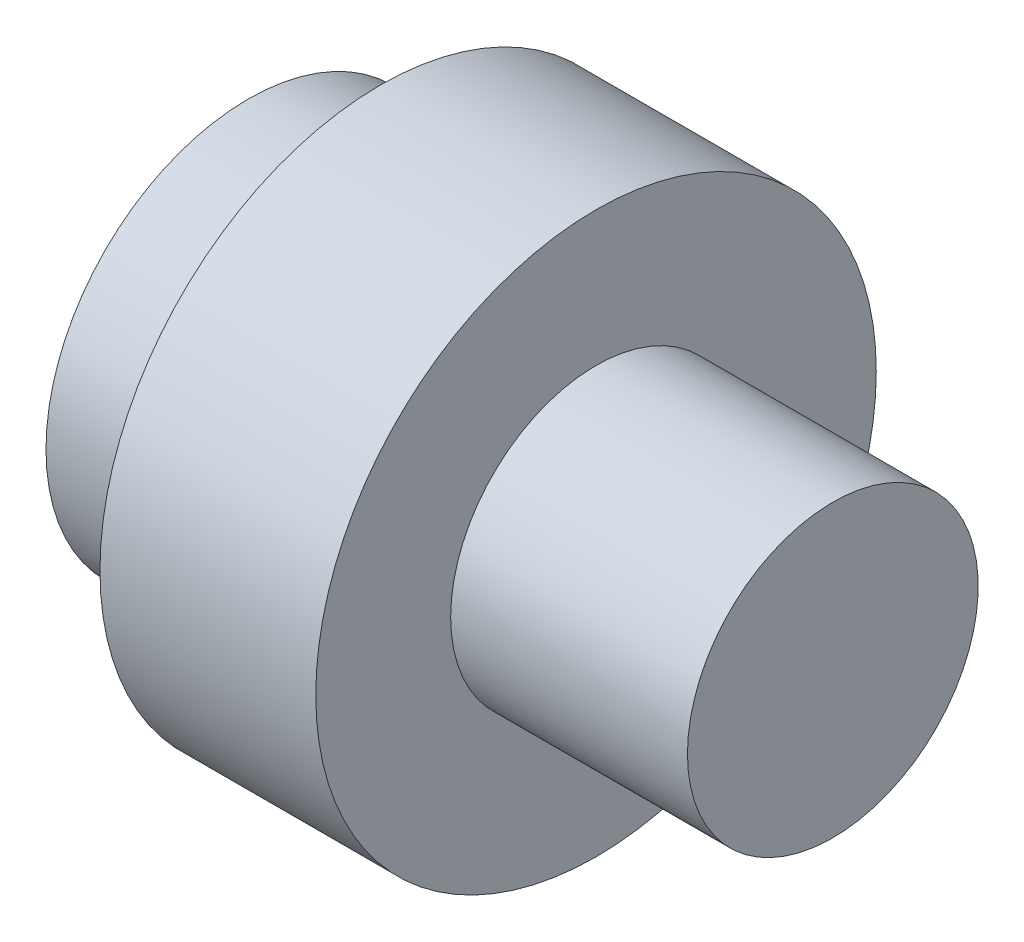
ISO-10303-21;
HEADER;
FILE_DESCRIPTION(('STEP AP214'),'2;1');
FILE_NAME('part.step','',(''),(''),'','','');
FILE_SCHEMA(('AUTOMOTIVE_DESIGN { 1 0 10303 214 1 1 1 1 }'));
ENDSEC;
DATA;
#1=APPLICATION_CONTEXT('core data for automotive mechanical design processes');
#2=APPLICATION_PROTOCOL_DEFINITION('international standard','automotive_design',2000,#1);
#3=PRODUCT_CONTEXT('',#1,'mechanical');
#4=PRODUCT('Part','Part','',(#3));
#5=PRODUCT_RELATED_PRODUCT_CATEGORY('part','',(#4));
#6=PRODUCT_DEFINITION_FORMATION('','',#4);
#7=PRODUCT_DEFINITION_CONTEXT('part definition',#1,'design');
#8=PRODUCT_DEFINITION('design','',#6,#7);
#9=PRODUCT_DEFINITION_SHAPE('','',#8);
#10=(LENGTH_UNIT() NAMED_UNIT(*) SI_UNIT(.MILLI.,.METRE.));
#11=(NAMED_UNIT(*) PLANE_ANGLE_UNIT() SI_UNIT($,.RADIAN.));
#12=(NAMED_UNIT(*) SI_UNIT($,.STERADIAN.) SOLID_ANGLE_UNIT());
#13=UNCERTAINTY_MEASURE_WITH_UNIT(LENGTH_MEASURE(1.E-05),#10,'distance_accuracy_value','');
#14=(GEOMETRIC_REPRESENTATION_CONTEXT(3) GLOBAL_UNCERTAINTY_ASSIGNED_CONTEXT((#13)) GLOBAL_UNIT_ASSIGNED_CONTEXT((#10,
#11,#12)) REPRESENTATION_CONTEXT('',''));
#15=CARTESIAN_POINT('',(0.,0.,0.));
#16=DIRECTION('',(0.,0.,1.));
#17=DIRECTION('',(1.,0.,0.));
#18=AXIS2_PLACEMENT_3D('',#15,#16,#17);
#19=CARTESIAN_POINT('',(0.,0.,0.));
#20=DIRECTION('',(1.,0.,0.));
#21=DIRECTION('',(0.,0.,-1.));
#22=AXIS2_PLACEMENT_3D('',#19,#20,#21);
#23=PLANE('',#22);
#24=CARTESIAN_POINT('',(0.,0.,0.));
#25=DIRECTION('',(-1.,0.,0.));
#26=DIRECTION('',(0.,0.,1.));
#27=AXIS2_PLACEMENT_3D('',#24,#25,#26);
#28=CIRCLE('',#27,18.0800790904597);
#29=CARTESIAN_POINT('',(0.,0.,18.0800790904597));
#30=VERTEX_POINT('',#29);
#31=EDGE_CURVE('E10',#30,#30,#28,.T.);
#32=ORIENTED_EDGE('',*,*,#31,.T.);
#33=EDGE_LOOP('',(#32));
#34=FACE_BOUND('',#33,.T.);
#35=ADVANCED_FACE('F30',(#34),#23,.F.);
#36=CARTESIAN_POINT('',(0.,0.,0.));
#37=DIRECTION('',(-1.,0.,0.));
#38=DIRECTION('',(0.,0.,1.));
#39=AXIS2_PLACEMENT_3D('',#36,#37,#38);
#40=CYLINDRICAL_SURFACE('',#39,18.0800790904597);
#41=ORIENTED_EDGE('',*,*,#31,.F.);
#42=EDGE_LOOP('',(#41));
#43=FACE_BOUND('',#42,.T.);
#44=CARTESIAN_POINT('',(11.7855330367441,0.,0.));
#45=DIRECTION('',(-1.,0.,0.));
#46=DIRECTION('',(0.,0.,1.));
#47=AXIS2_PLACEMENT_3D('',#44,#45,#46);
#48=CIRCLE('',#47,18.0800790904597);
#49=CARTESIAN_POINT('',(11.7855330367441,0.,18.0800790904597));
#50=VERTEX_POINT('',#49);
#51=EDGE_CURVE('E36',#50,#50,#48,.T.);
#52=ORIENTED_EDGE('',*,*,#51,.T.);
#53=EDGE_LOOP('',(#52));
#54=FACE_BOUND('',#53,.T.);
#55=ADVANCED_FACE('F68',(#43,#54),#40,.T.);
#56=CARTESIAN_POINT('',(11.7855330367441,18.0800790904597,0.));
#57=DIRECTION('',(1.,0.,0.));
#58=DIRECTION('',(0.,0.,-1.));
#59=AXIS2_PLACEMENT_3D('',#56,#57,#58);
#60=PLANE('',#59);
#61=ORIENTED_EDGE('',*,*,#51,.F.);
#62=EDGE_LOOP('',(#61));
#63=FACE_BOUND('',#62,.T.);
#64=CARTESIAN_POINT('',(11.7855330367441,0.,0.));
#65=DIRECTION('',(-1.,0.,0.));
#66=DIRECTION('',(0.,0.,1.));
#67=AXIS2_PLACEMENT_3D('',#64,#65,#66);
#68=CIRCLE('',#67,25.0442577030812);
#69=CARTESIAN_POINT('',(11.7855330367441,0.,25.0442577030812));
#70=VERTEX_POINT('',#69);
#71=EDGE_CURVE('E40',#70,#70,#68,.T.);
#72=ORIENTED_EDGE('',*,*,#71,.T.);
#73=EDGE_LOOP('',(#72));
#74=FACE_BOUND('',#73,.T.);
#75=ADVANCED_FACE('F72',(#63,#74),#60,.F.);
#76=CARTESIAN_POINT('',(0.,0.,0.));
#77=DIRECTION('',(-1.,0.,0.));
#78=DIRECTION('',(0.,0.,1.));
#79=AXIS2_PLACEMENT_3D('',#76,#77,#78);
#80=CYLINDRICAL_SURFACE('',#79,25.0442577030812);
#81=ORIENTED_EDGE('',*,*,#71,.F.);
#82=EDGE_LOOP('',(#81));
#83=FACE_BOUND('',#82,.T.);
#84=CARTESIAN_POINT('',(31.0709507332345,0.,0.));
#85=DIRECTION('',(-1.,0.,0.));
#86=DIRECTION('',(0.,0.,1.));
#87=AXIS2_PLACEMENT_3D('',#84,#85,#86);
#88=CIRCLE('',#87,25.0442577030812);
#89=CARTESIAN_POINT('',(31.0709507332345,0.,25.0442577030812));
#90=VERTEX_POINT('',#89);
#91=EDGE_CURVE('E44',#90,#90,#88,.T.);
#92=ORIENTED_EDGE('',*,*,#91,.T.);
#93=EDGE_LOOP('',(#92));
#94=FACE_BOUND('',#93,.T.);
#95=ADVANCED_FACE('F77',(#83,#94),#80,.T.);
#96=CARTESIAN_POINT('',(31.0709507332345,25.0442577030812,0.));
#97=DIRECTION('',(-1.,0.,0.));
#98=DIRECTION('',(0.,0.,1.));
#99=AXIS2_PLACEMENT_3D('',#96,#97,#98);
#100=PLANE('',#99);
#101=ORIENTED_EDGE('',*,*,#91,.F.);
#102=EDGE_LOOP('',(#101));
#103=FACE_BOUND('',#102,.T.);
#104=CARTESIAN_POINT('',(31.0709507332345,0.,0.));
#105=DIRECTION('',(-1.,0.,0.));
#106=DIRECTION('',(0.,0.,1.));
#107=AXIS2_PLACEMENT_3D('',#104,#105,#106);
#108=CIRCLE('',#107,12.9908716427748);
#109=CARTESIAN_POINT('',(31.0709507332345,0.,12.9908716427748));
#110=VERTEX_POINT('',#109);
#111=EDGE_CURVE('E49',#110,#110,#108,.T.);
#112=ORIENTED_EDGE('',*,*,#111,.T.);
#113=EDGE_LOOP('',(#112));
#114=FACE_BOUND('',#113,.T.);
#115=ADVANCED_FACE('F64',(#103,#114),#100,.F.);
#116=CARTESIAN_POINT('',(0.,0.,0.));
#117=DIRECTION('',(-1.,0.,0.));
#118=DIRECTION('',(0.,0.,1.));
#119=AXIS2_PLACEMENT_3D('',#116,#117,#118);
#120=CYLINDRICAL_SURFACE('',#119,12.9908716427748);
#121=ORIENTED_EDGE('',*,*,#111,.F.);
#122=EDGE_LOOP('',(#121));
#123=FACE_BOUND('',#122,.T.);
#124=CARTESIAN_POINT('',(52.2313395946614,0.,0.));
#125=DIRECTION('',(-1.,0.,0.));
#126=DIRECTION('',(0.,0.,1.));
#127=AXIS2_PLACEMENT_3D('',#124,#125,#126);
#128=CIRCLE('',#127,12.9908716427748);
#129=CARTESIAN_POINT('',(52.2313395946614,0.,12.9908716427748));
#130=VERTEX_POINT('',#129);
#131=EDGE_CURVE('E52',#130,#130,#128,.T.);
#132=ORIENTED_EDGE('',*,*,#131,.T.);
#133=EDGE_LOOP('',(#132));
#134=FACE_BOUND('',#133,.T.);
#135=ADVANCED_FACE('F56',(#123,#134),#120,.T.);
#136=CARTESIAN_POINT('',(52.2313395946614,12.9908716427748,0.));
#137=DIRECTION('',(-1.,0.,0.));
#138=DIRECTION('',(0.,0.,1.));
#139=AXIS2_PLACEMENT_3D('',#136,#137,#138);
#140=PLANE('',#139);
#141=ORIENTED_EDGE('',*,*,#131,.F.);
#142=EDGE_LOOP('',(#141));
#143=FACE_BOUND('',#142,.T.);
#144=ADVANCED_FACE('F58',(#143),#140,.F.);
#145=CLOSED_SHELL('',(#35,#55,#75,#95,#115,#135,#144));
#146=MANIFOLD_SOLID_BREP('B2',#145);
#147=ADVANCED_BREP_SHAPE_REPRESENTATION('',(#18,#146),#14);
#148=SHAPE_DEFINITION_REPRESENTATION(#9,#147);
ENDSEC;
END-ISO-10303-21;
